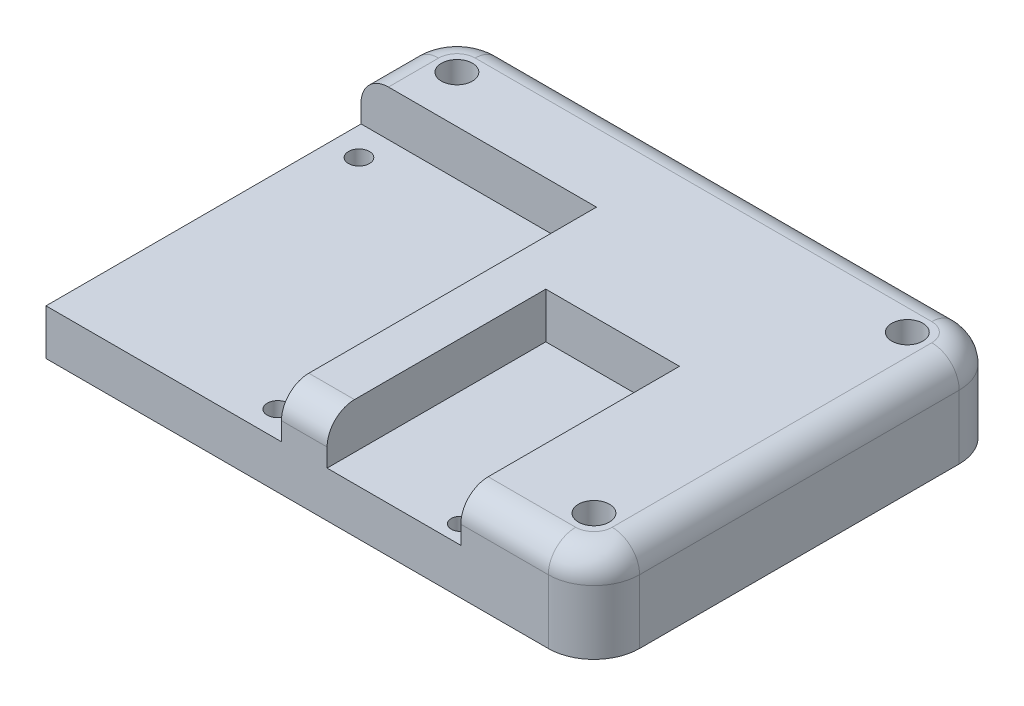
ISO-10303-21;
HEADER;
FILE_DESCRIPTION(('STEP AP214'),'2;1');
FILE_NAME('part.step','',(''),(''),'','','');
FILE_SCHEMA(('AUTOMOTIVE_DESIGN { 1 0 10303 214 1 1 1 1 }'));
ENDSEC;
DATA;
#1=APPLICATION_CONTEXT('core data for automotive mechanical design processes');
#2=APPLICATION_PROTOCOL_DEFINITION('international standard','automotive_design',2000,#1);
#3=PRODUCT_CONTEXT('',#1,'mechanical');
#4=PRODUCT('Part','Part','',(#3));
#5=PRODUCT_RELATED_PRODUCT_CATEGORY('part','',(#4));
#6=PRODUCT_DEFINITION_FORMATION('','',#4);
#7=PRODUCT_DEFINITION_CONTEXT('part definition',#1,'design');
#8=PRODUCT_DEFINITION('design','',#6,#7);
#9=PRODUCT_DEFINITION_SHAPE('','',#8);
#10=(LENGTH_UNIT() NAMED_UNIT(*) SI_UNIT(.MILLI.,.METRE.));
#11=(NAMED_UNIT(*) PLANE_ANGLE_UNIT() SI_UNIT($,.RADIAN.));
#12=(NAMED_UNIT(*) SI_UNIT($,.STERADIAN.) SOLID_ANGLE_UNIT());
#13=UNCERTAINTY_MEASURE_WITH_UNIT(LENGTH_MEASURE(1.E-05),#10,'distance_accuracy_value','');
#14=(GEOMETRIC_REPRESENTATION_CONTEXT(3) GLOBAL_UNCERTAINTY_ASSIGNED_CONTEXT((#13)) GLOBAL_UNIT_ASSIGNED_CONTEXT((#10,
#11,#12)) REPRESENTATION_CONTEXT('',''));
#15=CARTESIAN_POINT('',(0.,0.,0.));
#16=DIRECTION('',(0.,0.,1.));
#17=DIRECTION('',(1.,0.,0.));
#18=AXIS2_PLACEMENT_3D('',#15,#16,#17);
#19=CARTESIAN_POINT('',(-39.1304347826087,10.,-20.7391304347826));
#20=DIRECTION('',(1.,0.,0.));
#21=DIRECTION('',(0.,0.,-1.));
#22=AXIS2_PLACEMENT_3D('',#19,#20,#21);
#23=PLANE('',#22);
#24=DIRECTION('',(0.,1.,0.));
#25=VECTOR('',#24,1.);
#26=CARTESIAN_POINT('',(-39.1304347826087,5.,-10.2391304347826));
#27=LINE('',#26,#25);
#28=CARTESIAN_POINT('',(-39.1304347826087,5.,-10.2391304347826));
#29=VERTEX_POINT('',#28);
#30=CARTESIAN_POINT('',(-39.1304347826087,7.,-10.2391304347826));
#31=VERTEX_POINT('',#30);
#32=EDGE_CURVE('E249',#29,#31,#27,.T.);
#33=ORIENTED_EDGE('',*,*,#32,.T.);
#34=DIRECTION('',(0.,0.,1.));
#35=VECTOR('',#34,1.);
#36=CARTESIAN_POINT('',(-39.1304347826087,7.,-15.7391304347826));
#37=LINE('',#36,#35);
#38=CARTESIAN_POINT('',(-39.1304347826087,7.,-15.7391304347826));
#39=VERTEX_POINT('',#38);
#40=EDGE_CURVE('E314',#31,#39,#37,.F.);
#41=ORIENTED_EDGE('',*,*,#40,.T.);
#42=DIRECTION('',(0.,-1.,0.));
#43=VECTOR('',#42,1.);
#44=CARTESIAN_POINT('',(-39.1304347826087,10.,-15.7391304347826));
#45=LINE('',#44,#43);
#46=CARTESIAN_POINT('',(-39.1304347826087,0.,-15.7391304347826));
#47=VERTEX_POINT('',#46);
#48=EDGE_CURVE('E265',#39,#47,#45,.T.);
#49=ORIENTED_EDGE('',*,*,#48,.T.);
#50=DIRECTION('',(0.,0.,1.));
#51=VECTOR('',#50,1.);
#52=CARTESIAN_POINT('',(-39.1304347826087,0.,-20.7391304347826));
#53=LINE('',#52,#51);
#54=CARTESIAN_POINT('',(-39.1304347826087,0.,24.2608695652174));
#55=VERTEX_POINT('',#54);
#56=EDGE_CURVE('E248',#47,#55,#53,.T.);
#57=ORIENTED_EDGE('',*,*,#56,.T.);
#58=DIRECTION('',(0.,-1.,0.));
#59=VECTOR('',#58,1.);
#60=CARTESIAN_POINT('',(-39.1304347826087,10.,24.2608695652174));
#61=LINE('',#60,#59);
#62=CARTESIAN_POINT('',(-39.1304347826087,5.,24.2608695652174));
#63=VERTEX_POINT('',#62);
#64=EDGE_CURVE('E262',#63,#55,#61,.T.);
#65=ORIENTED_EDGE('',*,*,#64,.F.);
#66=DIRECTION('',(0.,0.,1.));
#67=VECTOR('',#66,1.);
#68=CARTESIAN_POINT('',(-39.1304347826087,5.,24.2608695652174));
#69=LINE('',#68,#67);
#70=EDGE_CURVE('E236',#29,#63,#69,.T.);
#71=ORIENTED_EDGE('',*,*,#70,.F.);
#72=EDGE_LOOP('',(#33,#41,#49,#57,#65,#71));
#73=FACE_BOUND('',#72,.T.);
#74=ADVANCED_FACE('F39',(#73),#23,.F.);
#75=CARTESIAN_POINT('',(-39.1304347826087,10.,24.2608695652174));
#76=DIRECTION('',(0.,0.,-1.));
#77=DIRECTION('',(-1.,0.,0.));
#78=AXIS2_PLACEMENT_3D('',#75,#76,#77);
#79=PLANE('',#78);
#80=DIRECTION('',(0.,1.,0.));
#81=VECTOR('',#80,1.);
#82=CARTESIAN_POINT('',(-8.3504347826087,5.,24.2608695652174));
#83=LINE('',#82,#81);
#84=CARTESIAN_POINT('',(-8.3504347826087,5.,24.2608695652174));
#85=VERTEX_POINT('',#84);
#86=CARTESIAN_POINT('',(-8.3504347826087,7.,24.2608695652174));
#87=VERTEX_POINT('',#86);
#88=EDGE_CURVE('E173',#85,#87,#83,.T.);
#89=ORIENTED_EDGE('',*,*,#88,.T.);
#90=DIRECTION('',(1.,0.,0.));
#91=VECTOR('',#90,1.);
#92=CARTESIAN_POINT('',(-13.3504347826087,7.,24.2608695652174));
#93=LINE('',#92,#91);
#94=CARTESIAN_POINT('',(-13.3504347826087,7.,24.2608695652174));
#95=VERTEX_POINT('',#94);
#96=EDGE_CURVE('E308',#87,#95,#93,.F.);
#97=ORIENTED_EDGE('',*,*,#96,.T.);
#98=DIRECTION('',(0.,1.,0.));
#99=VECTOR('',#98,1.);
#100=CARTESIAN_POINT('',(-13.3504347826087,5.,24.2608695652174));
#101=LINE('',#100,#99);
#102=CARTESIAN_POINT('',(-13.3504347826087,5.,24.2608695652174));
#103=VERTEX_POINT('',#102);
#104=EDGE_CURVE('E245',#103,#95,#101,.T.);
#105=ORIENTED_EDGE('',*,*,#104,.F.);
#106=DIRECTION('',(1.,0.,0.));
#107=VECTOR('',#106,1.);
#108=CARTESIAN_POINT('',(-13.3504347826087,5.,24.2608695652174));
#109=LINE('',#108,#107);
#110=EDGE_CURVE('E238',#63,#103,#109,.T.);
#111=ORIENTED_EDGE('',*,*,#110,.F.);
#112=ORIENTED_EDGE('',*,*,#64,.T.);
#113=DIRECTION('',(1.,0.,0.));
#114=VECTOR('',#113,1.);
#115=CARTESIAN_POINT('',(-39.1304347826087,0.,24.2608695652174));
#116=LINE('',#115,#114);
#117=CARTESIAN_POINT('',(15.8695652173913,0.,24.2608695652174));
#118=VERTEX_POINT('',#117);
#119=EDGE_CURVE('E255',#55,#118,#116,.T.);
#120=ORIENTED_EDGE('',*,*,#119,.T.);
#121=DIRECTION('',(0.,-1.,0.));
#122=VECTOR('',#121,1.);
#123=CARTESIAN_POINT('',(15.8695652173913,10.,24.2608695652174));
#124=LINE('',#123,#122);
#125=CARTESIAN_POINT('',(15.8695652173913,7.,24.2608695652174));
#126=VERTEX_POINT('',#125);
#127=EDGE_CURVE('E284',#118,#126,#124,.F.);
#128=ORIENTED_EDGE('',*,*,#127,.T.);
#129=DIRECTION('',(1.,0.,0.));
#130=VECTOR('',#129,1.);
#131=CARTESIAN_POINT('',(6.2895652173913,7.,24.2608695652174));
#132=LINE('',#131,#130);
#133=CARTESIAN_POINT('',(6.2895652173913,7.,24.2608695652174));
#134=VERTEX_POINT('',#133);
#135=EDGE_CURVE('E306',#126,#134,#132,.F.);
#136=ORIENTED_EDGE('',*,*,#135,.T.);
#137=DIRECTION('',(0.,1.,0.));
#138=VECTOR('',#137,1.);
#139=CARTESIAN_POINT('',(6.2895652173913,5.,24.2608695652174));
#140=LINE('',#139,#138);
#141=CARTESIAN_POINT('',(6.2895652173913,5.,24.2608695652174));
#142=VERTEX_POINT('',#141);
#143=EDGE_CURVE('E183',#142,#134,#140,.T.);
#144=ORIENTED_EDGE('',*,*,#143,.F.);
#145=DIRECTION('',(1.,0.,0.));
#146=VECTOR('',#145,1.);
#147=CARTESIAN_POINT('',(-8.3504347826087,5.,24.2608695652174));
#148=LINE('',#147,#146);
#149=EDGE_CURVE('E190',#85,#142,#148,.T.);
#150=ORIENTED_EDGE('',*,*,#149,.F.);
#151=EDGE_LOOP('',(#89,#97,#105,#111,#112,#120,#128,#136,#144,#150));
#152=FACE_BOUND('',#151,.T.);
#153=ADVANCED_FACE('F195',(#152),#79,.F.);
#154=CARTESIAN_POINT('',(20.8695652173913,10.,-20.7391304347826));
#155=DIRECTION('',(-1.,0.,0.));
#156=DIRECTION('',(0.,0.,1.));
#157=AXIS2_PLACEMENT_3D('',#154,#155,#156);
#158=PLANE('',#157);
#159=DIRECTION('',(0.,-1.,0.));
#160=VECTOR('',#159,1.);
#161=CARTESIAN_POINT('',(20.8695652173913,10.,-15.7391304347826));
#162=LINE('',#161,#160);
#163=CARTESIAN_POINT('',(20.8695652173913,0.,-15.7391304347826));
#164=VERTEX_POINT('',#163);
#165=CARTESIAN_POINT('',(20.8695652173913,7.,-15.7391304347826));
#166=VERTEX_POINT('',#165);
#167=EDGE_CURVE('E278',#164,#166,#162,.F.);
#168=ORIENTED_EDGE('',*,*,#167,.T.);
#169=DIRECTION('',(0.,0.,-1.));
#170=VECTOR('',#169,1.);
#171=CARTESIAN_POINT('',(20.8695652173913,7.,19.2608695652174));
#172=LINE('',#171,#170);
#173=CARTESIAN_POINT('',(20.8695652173913,7.,19.2608695652174));
#174=VERTEX_POINT('',#173);
#175=EDGE_CURVE('E56',#166,#174,#172,.F.);
#176=ORIENTED_EDGE('',*,*,#175,.T.);
#177=DIRECTION('',(0.,-1.,0.));
#178=VECTOR('',#177,1.);
#179=CARTESIAN_POINT('',(20.8695652173913,10.,19.2608695652174));
#180=LINE('',#179,#178);
#181=CARTESIAN_POINT('',(20.8695652173913,0.,19.2608695652174));
#182=VERTEX_POINT('',#181);
#183=EDGE_CURVE('E280',#174,#182,#180,.T.);
#184=ORIENTED_EDGE('',*,*,#183,.T.);
#185=DIRECTION('',(0.,0.,-1.));
#186=VECTOR('',#185,1.);
#187=CARTESIAN_POINT('',(20.8695652173913,0.,-20.7391304347826));
#188=LINE('',#187,#186);
#189=EDGE_CURVE('E258',#182,#164,#188,.T.);
#190=ORIENTED_EDGE('',*,*,#189,.T.);
#191=EDGE_LOOP('',(#168,#176,#184,#190));
#192=FACE_BOUND('',#191,.T.);
#193=ADVANCED_FACE('F448',(#192),#158,.F.);
#194=CARTESIAN_POINT('',(-39.1304347826087,10.,-20.7391304347826));
#195=DIRECTION('',(0.,0.,1.));
#196=DIRECTION('',(1.,0.,0.));
#197=AXIS2_PLACEMENT_3D('',#194,#195,#196);
#198=PLANE('',#197);
#199=DIRECTION('',(0.,-1.,0.));
#200=VECTOR('',#199,1.);
#201=CARTESIAN_POINT('',(-34.1304347826087,10.,-20.7391304347826));
#202=LINE('',#201,#200);
#203=CARTESIAN_POINT('',(-34.1304347826087,0.,-20.7391304347826));
#204=VERTEX_POINT('',#203);
#205=CARTESIAN_POINT('',(-34.1304347826087,7.,-20.7391304347826));
#206=VERTEX_POINT('',#205);
#207=EDGE_CURVE('E270',#204,#206,#202,.F.);
#208=ORIENTED_EDGE('',*,*,#207,.T.);
#209=DIRECTION('',(-1.,0.,0.));
#210=VECTOR('',#209,1.);
#211=CARTESIAN_POINT('',(15.8695652173913,7.,-20.7391304347826));
#212=LINE('',#211,#210);
#213=CARTESIAN_POINT('',(15.8695652173913,7.,-20.7391304347826));
#214=VERTEX_POINT('',#213);
#215=EDGE_CURVE('E318',#206,#214,#212,.F.);
#216=ORIENTED_EDGE('',*,*,#215,.T.);
#217=DIRECTION('',(0.,-1.,0.));
#218=VECTOR('',#217,1.);
#219=CARTESIAN_POINT('',(15.8695652173913,10.,-20.7391304347826));
#220=LINE('',#219,#218);
#221=CARTESIAN_POINT('',(15.8695652173913,0.,-20.7391304347826));
#222=VERTEX_POINT('',#221);
#223=EDGE_CURVE('E273',#214,#222,#220,.T.);
#224=ORIENTED_EDGE('',*,*,#223,.T.);
#225=DIRECTION('',(-1.,0.,0.));
#226=VECTOR('',#225,1.);
#227=CARTESIAN_POINT('',(-39.1304347826087,0.,-20.7391304347826));
#228=LINE('',#227,#226);
#229=EDGE_CURVE('E260',#222,#204,#228,.T.);
#230=ORIENTED_EDGE('',*,*,#229,.T.);
#231=EDGE_LOOP('',(#208,#216,#224,#230));
#232=FACE_BOUND('',#231,.T.);
#233=ADVANCED_FACE('F383',(#232),#198,.F.);
#234=CARTESIAN_POINT('',(0.,10.,0.));
#235=DIRECTION('',(0.,1.,0.));
#236=DIRECTION('',(0.,0.,1.));
#237=AXIS2_PLACEMENT_3D('',#234,#235,#236);
#238=PLANE('',#237);
#239=CARTESIAN_POINT('',(-33.7904347826087,10.,-15.3951904347826));
#240=DIRECTION('',(0.,1.,0.));
#241=DIRECTION('',(0.,0.,1.));
#242=AXIS2_PLACEMENT_3D('',#239,#240,#241);
#243=CIRCLE('',#242,1.7);
#244=CARTESIAN_POINT('',(-33.7904347826087,10.,-13.6951904347826));
#245=VERTEX_POINT('',#244);
#246=EDGE_CURVE('E368',#245,#245,#243,.T.);
#247=ORIENTED_EDGE('',*,*,#246,.F.);
#248=EDGE_LOOP('',(#247));
#249=FACE_BOUND('',#248,.T.);
#250=CARTESIAN_POINT('',(15.5295652173913,10.,-15.3991304347826));
#251=DIRECTION('',(0.,1.,0.));
#252=DIRECTION('',(0.,0.,1.));
#253=AXIS2_PLACEMENT_3D('',#250,#251,#252);
#254=CIRCLE('',#253,1.7);
#255=CARTESIAN_POINT('',(15.5295652173913,10.,-13.6991304347826));
#256=VERTEX_POINT('',#255);
#257=EDGE_CURVE('E361',#256,#256,#254,.T.);
#258=ORIENTED_EDGE('',*,*,#257,.F.);
#259=EDGE_LOOP('',(#258));
#260=FACE_BOUND('',#259,.T.);
#261=CARTESIAN_POINT('',(15.5295652173913,10.,18.9208695652174));
#262=DIRECTION('',(0.,1.,0.));
#263=DIRECTION('',(0.,0.,1.));
#264=AXIS2_PLACEMENT_3D('',#261,#262,#263);
#265=CIRCLE('',#264,1.7);
#266=CARTESIAN_POINT('',(15.5295652173913,10.,20.6208695652174));
#267=VERTEX_POINT('',#266);
#268=EDGE_CURVE('E362',#267,#267,#265,.T.);
#269=ORIENTED_EDGE('',*,*,#268,.F.);
#270=EDGE_LOOP('',(#269));
#271=FACE_BOUND('',#270,.T.);
#272=DIRECTION('',(0.,0.,-1.));
#273=VECTOR('',#272,1.);
#274=CARTESIAN_POINT('',(-13.3504347826087,10.,24.2608695652174));
#275=LINE('',#274,#273);
#276=CARTESIAN_POINT('',(-13.3504347826087,10.,21.2608695652174));
#277=VERTEX_POINT('',#276);
#278=CARTESIAN_POINT('',(-13.3504347826087,10.,-10.2391304347826));
#279=VERTEX_POINT('',#278);
#280=EDGE_CURVE('E224',#277,#279,#275,.T.);
#281=ORIENTED_EDGE('',*,*,#280,.F.);
#282=DIRECTION('',(1.,0.,0.));
#283=VECTOR('',#282,1.);
#284=CARTESIAN_POINT('',(-8.3504347826087,10.,21.2608695652174));
#285=LINE('',#284,#283);
#286=CARTESIAN_POINT('',(-8.3504347826087,10.,21.2608695652174));
#287=VERTEX_POINT('',#286);
#288=EDGE_CURVE('E302',#277,#287,#285,.T.);
#289=ORIENTED_EDGE('',*,*,#288,.T.);
#290=DIRECTION('',(0.,0.,1.));
#291=VECTOR('',#290,1.);
#292=CARTESIAN_POINT('',(-8.3504347826087,10.,24.2608695652174));
#293=LINE('',#292,#291);
#294=CARTESIAN_POINT('',(-8.3504347826087,10.,0.310869565217385));
#295=VERTEX_POINT('',#294);
#296=EDGE_CURVE('E203',#295,#287,#293,.T.);
#297=ORIENTED_EDGE('',*,*,#296,.F.);
#298=DIRECTION('',(-1.,0.,0.));
#299=VECTOR('',#298,1.);
#300=CARTESIAN_POINT('',(-8.3504347826087,10.,0.310869565217385));
#301=LINE('',#300,#299);
#302=CARTESIAN_POINT('',(6.2895652173913,10.,0.310869565217385));
#303=VERTEX_POINT('',#302);
#304=EDGE_CURVE('E193',#303,#295,#301,.T.);
#305=ORIENTED_EDGE('',*,*,#304,.F.);
#306=DIRECTION('',(0.,0.,-1.));
#307=VECTOR('',#306,1.);
#308=CARTESIAN_POINT('',(6.2895652173913,10.,24.2608695652174));
#309=LINE('',#308,#307);
#310=CARTESIAN_POINT('',(6.2895652173913,10.,21.2608695652174));
#311=VERTEX_POINT('',#310);
#312=EDGE_CURVE('E205',#311,#303,#309,.T.);
#313=ORIENTED_EDGE('',*,*,#312,.F.);
#314=DIRECTION('',(1.,0.,0.));
#315=VECTOR('',#314,1.);
#316=CARTESIAN_POINT('',(15.8695652173913,10.,21.2608695652174));
#317=LINE('',#316,#315);
#318=CARTESIAN_POINT('',(15.8695652173913,10.,21.2608695652174));
#319=VERTEX_POINT('',#318);
#320=EDGE_CURVE('E287',#311,#319,#317,.T.);
#321=ORIENTED_EDGE('',*,*,#320,.T.);
#322=CARTESIAN_POINT('',(15.8695652173913,10.,19.2608695652174));
#323=DIRECTION('',(0.,1.,0.));
#324=DIRECTION('',(0.,0.,1.));
#325=AXIS2_PLACEMENT_3D('',#322,#323,#324);
#326=CIRCLE('',#325,2.);
#327=CARTESIAN_POINT('',(17.8695652173913,10.,19.2608695652174));
#328=VERTEX_POINT('',#327);
#329=EDGE_CURVE('E289',#319,#328,#326,.T.);
#330=ORIENTED_EDGE('',*,*,#329,.T.);
#331=DIRECTION('',(0.,0.,-1.));
#332=VECTOR('',#331,1.);
#333=CARTESIAN_POINT('',(17.8695652173913,10.,-15.7391304347826));
#334=LINE('',#333,#332);
#335=CARTESIAN_POINT('',(17.8695652173913,10.,-15.7391304347826));
#336=VERTEX_POINT('',#335);
#337=EDGE_CURVE('E291',#328,#336,#334,.T.);
#338=ORIENTED_EDGE('',*,*,#337,.T.);
#339=CARTESIAN_POINT('',(15.8695652173913,10.,-15.7391304347826));
#340=DIRECTION('',(0.,1.,0.));
#341=DIRECTION('',(0.,0.,1.));
#342=AXIS2_PLACEMENT_3D('',#339,#340,#341);
#343=CIRCLE('',#342,2.);
#344=CARTESIAN_POINT('',(15.8695652173913,10.,-17.7391304347826));
#345=VERTEX_POINT('',#344);
#346=EDGE_CURVE('E293',#336,#345,#343,.T.);
#347=ORIENTED_EDGE('',*,*,#346,.T.);
#348=DIRECTION('',(-1.,0.,0.));
#349=VECTOR('',#348,1.);
#350=CARTESIAN_POINT('',(-34.1304347826087,10.,-17.7391304347826));
#351=LINE('',#350,#349);
#352=CARTESIAN_POINT('',(-34.1304347826087,10.,-17.7391304347826));
#353=VERTEX_POINT('',#352);
#354=EDGE_CURVE('E295',#345,#353,#351,.T.);
#355=ORIENTED_EDGE('',*,*,#354,.T.);
#356=CARTESIAN_POINT('',(-34.1304347826087,10.,-15.7391304347826));
#357=DIRECTION('',(0.,1.,0.));
#358=DIRECTION('',(0.,0.,1.));
#359=AXIS2_PLACEMENT_3D('',#356,#357,#358);
#360=CIRCLE('',#359,2.);
#361=CARTESIAN_POINT('',(-36.1304347826087,10.,-15.7391304347826));
#362=VERTEX_POINT('',#361);
#363=EDGE_CURVE('E297',#353,#362,#360,.T.);
#364=ORIENTED_EDGE('',*,*,#363,.T.);
#365=DIRECTION('',(0.,0.,1.));
#366=VECTOR('',#365,1.);
#367=CARTESIAN_POINT('',(-36.1304347826087,10.,-10.2391304347826));
#368=LINE('',#367,#366);
#369=CARTESIAN_POINT('',(-36.1304347826087,10.,-10.2391304347826));
#370=VERTEX_POINT('',#369);
#371=EDGE_CURVE('E299',#362,#370,#368,.T.);
#372=ORIENTED_EDGE('',*,*,#371,.T.);
#373=DIRECTION('',(-1.,0.,0.));
#374=VECTOR('',#373,1.);
#375=CARTESIAN_POINT('',(-13.3504347826087,10.,-10.2391304347826));
#376=LINE('',#375,#374);
#377=EDGE_CURVE('E233',#279,#370,#376,.T.);
#378=ORIENTED_EDGE('',*,*,#377,.F.);
#379=EDGE_LOOP('',(#281,#289,#297,#305,#313,#321,#330,#338,#347,#355,#364,#372,#378));
#380=FACE_BOUND('',#379,.T.);
#381=ADVANCED_FACE('F379',(#249,#260,#271,#380),#238,.T.);
#382=CARTESIAN_POINT('',(0.,0.,0.));
#383=DIRECTION('',(0.,1.,0.));
#384=DIRECTION('',(0.,0.,1.));
#385=AXIS2_PLACEMENT_3D('',#382,#383,#384);
#386=PLANE('',#385);
#387=CARTESIAN_POINT('',(-33.7904347826087,0.,-15.3951904347826));
#388=DIRECTION('',(0.,1.,0.));
#389=DIRECTION('',(0.,0.,1.));
#390=AXIS2_PLACEMENT_3D('',#387,#388,#389);
#391=CIRCLE('',#390,1.7);
#392=CARTESIAN_POINT('',(-33.7904347826087,0.,-13.6951904347826));
#393=VERTEX_POINT('',#392);
#394=EDGE_CURVE('E327',#393,#393,#391,.F.);
#395=ORIENTED_EDGE('',*,*,#394,.F.);
#396=EDGE_LOOP('',(#395));
#397=FACE_BOUND('',#396,.T.);
#398=CARTESIAN_POINT('',(15.5295652173913,0.,-15.3991304347826));
#399=DIRECTION('',(0.,1.,0.));
#400=DIRECTION('',(0.,0.,1.));
#401=AXIS2_PLACEMENT_3D('',#398,#399,#400);
#402=CIRCLE('',#401,1.7);
#403=CARTESIAN_POINT('',(15.5295652173913,0.,-13.6991304347826));
#404=VERTEX_POINT('',#403);
#405=EDGE_CURVE('E365',#404,#404,#402,.F.);
#406=ORIENTED_EDGE('',*,*,#405,.F.);
#407=EDGE_LOOP('',(#406));
#408=FACE_BOUND('',#407,.T.);
#409=CARTESIAN_POINT('',(15.5295652173913,0.,18.9208695652174));
#410=DIRECTION('',(0.,1.,0.));
#411=DIRECTION('',(0.,0.,1.));
#412=AXIS2_PLACEMENT_3D('',#409,#410,#411);
#413=CIRCLE('',#412,1.7);
#414=CARTESIAN_POINT('',(15.5295652173913,0.,20.6208695652174));
#415=VERTEX_POINT('',#414);
#416=EDGE_CURVE('E358',#415,#415,#413,.F.);
#417=ORIENTED_EDGE('',*,*,#416,.F.);
#418=EDGE_LOOP('',(#417));
#419=FACE_BOUND('',#418,.T.);
#420=CARTESIAN_POINT('',(4.2445652173913,0.,2.33086956521739));
#421=DIRECTION('',(0.,1.,0.));
#422=DIRECTION('',(0.,0.,1.));
#423=AXIS2_PLACEMENT_3D('',#420,#421,#422);
#424=CIRCLE('',#423,1.015);
#425=CARTESIAN_POINT('',(4.2445652173913,0.,3.34586956521739));
#426=VERTEX_POINT('',#425);
#427=EDGE_CURVE('E206',#426,#426,#424,.F.);
#428=ORIENTED_EDGE('',*,*,#427,.F.);
#429=EDGE_LOOP('',(#428));
#430=FACE_BOUND('',#429,.T.);
#431=CARTESIAN_POINT('',(4.2395652173913,0.,22.2458695652174));
#432=DIRECTION('',(0.,1.,0.));
#433=DIRECTION('',(0.,0.,1.));
#434=AXIS2_PLACEMENT_3D('',#431,#432,#433);
#435=CIRCLE('',#434,1.015);
#436=CARTESIAN_POINT('',(4.2395652173913,0.,23.2608695652174));
#437=VERTEX_POINT('',#436);
#438=EDGE_CURVE('E347',#437,#437,#435,.F.);
#439=ORIENTED_EDGE('',*,*,#438,.F.);
#440=EDGE_LOOP('',(#439));
#441=FACE_BOUND('',#440,.T.);
#442=CARTESIAN_POINT('',(-36.0604347826087,0.,-6.93913043478262));
#443=DIRECTION('',(0.,1.,0.));
#444=DIRECTION('',(0.,0.,1.));
#445=AXIS2_PLACEMENT_3D('',#442,#443,#444);
#446=CIRCLE('',#445,1.15);
#447=CARTESIAN_POINT('',(-36.0604347826087,0.,-5.78913043478261));
#448=VERTEX_POINT('',#447);
#449=EDGE_CURVE('E220',#448,#448,#446,.F.);
#450=ORIENTED_EDGE('',*,*,#449,.F.);
#451=EDGE_LOOP('',(#450));
#452=FACE_BOUND('',#451,.T.);
#453=CARTESIAN_POINT('',(-16.6404347826087,0.,21.3708695652174));
#454=DIRECTION('',(0.,1.,0.));
#455=DIRECTION('',(0.,0.,1.));
#456=AXIS2_PLACEMENT_3D('',#453,#454,#455);
#457=CIRCLE('',#456,1.15);
#458=CARTESIAN_POINT('',(-16.6404347826087,0.,22.5208695652174));
#459=VERTEX_POINT('',#458);
#460=EDGE_CURVE('E221',#459,#459,#457,.F.);
#461=ORIENTED_EDGE('',*,*,#460,.F.);
#462=EDGE_LOOP('',(#461));
#463=FACE_BOUND('',#462,.T.);
#464=ORIENTED_EDGE('',*,*,#189,.F.);
#465=CARTESIAN_POINT('',(15.8695652173913,0.,19.2608695652174));
#466=DIRECTION('',(0.,1.,0.));
#467=DIRECTION('',(0.,0.,1.));
#468=AXIS2_PLACEMENT_3D('',#465,#466,#467);
#469=CIRCLE('',#468,5.);
#470=EDGE_CURVE('E282',#182,#118,#469,.F.);
#471=ORIENTED_EDGE('',*,*,#470,.T.);
#472=ORIENTED_EDGE('',*,*,#119,.F.);
#473=ORIENTED_EDGE('',*,*,#56,.F.);
#474=CARTESIAN_POINT('',(-34.1304347826087,0.,-15.7391304347826));
#475=DIRECTION('',(0.,1.,0.));
#476=DIRECTION('',(0.,0.,1.));
#477=AXIS2_PLACEMENT_3D('',#474,#475,#476);
#478=CIRCLE('',#477,5.);
#479=EDGE_CURVE('E267',#47,#204,#478,.F.);
#480=ORIENTED_EDGE('',*,*,#479,.T.);
#481=ORIENTED_EDGE('',*,*,#229,.F.);
#482=CARTESIAN_POINT('',(15.8695652173913,0.,-15.7391304347826));
#483=DIRECTION('',(0.,1.,0.));
#484=DIRECTION('',(0.,0.,1.));
#485=AXIS2_PLACEMENT_3D('',#482,#483,#484);
#486=CIRCLE('',#485,5.);
#487=EDGE_CURVE('E275',#222,#164,#486,.F.);
#488=ORIENTED_EDGE('',*,*,#487,.T.);
#489=EDGE_LOOP('',(#464,#471,#472,#473,#480,#481,#488));
#490=FACE_BOUND('',#489,.T.);
#491=ADVANCED_FACE('F382',(#397,#408,#419,#430,#441,#452,#463,#490),#386,.F.);
#492=CARTESIAN_POINT('',(-13.3504347826087,5.,24.2608695652174));
#493=DIRECTION('',(1.,0.,0.));
#494=DIRECTION('',(0.,0.,-1.));
#495=AXIS2_PLACEMENT_3D('',#492,#493,#494);
#496=PLANE('',#495);
#497=ORIENTED_EDGE('',*,*,#104,.T.);
#498=CARTESIAN_POINT('',(-13.3504347826087,7.,21.2608695652174));
#499=DIRECTION('',(1.,0.,0.));
#500=DIRECTION('',(0.,0.,-1.));
#501=AXIS2_PLACEMENT_3D('',#498,#499,#500);
#502=CIRCLE('',#501,3.);
#503=EDGE_CURVE('E310',#95,#277,#502,.F.);
#504=ORIENTED_EDGE('',*,*,#503,.T.);
#505=ORIENTED_EDGE('',*,*,#280,.T.);
#506=DIRECTION('',(0.,1.,0.));
#507=VECTOR('',#506,1.);
#508=CARTESIAN_POINT('',(-13.3504347826087,5.,-10.2391304347826));
#509=LINE('',#508,#507);
#510=CARTESIAN_POINT('',(-13.3504347826087,5.,-10.2391304347826));
#511=VERTEX_POINT('',#510);
#512=EDGE_CURVE('E241',#511,#279,#509,.T.);
#513=ORIENTED_EDGE('',*,*,#512,.F.);
#514=DIRECTION('',(0.,0.,-1.));
#515=VECTOR('',#514,1.);
#516=CARTESIAN_POINT('',(-13.3504347826087,5.,24.2608695652174));
#517=LINE('',#516,#515);
#518=EDGE_CURVE('E229',#103,#511,#517,.T.);
#519=ORIENTED_EDGE('',*,*,#518,.F.);
#520=EDGE_LOOP('',(#497,#504,#505,#513,#519));
#521=FACE_BOUND('',#520,.T.);
#522=ADVANCED_FACE('F399',(#521),#496,.F.);
#523=CARTESIAN_POINT('',(-13.3504347826087,5.,-10.2391304347826));
#524=DIRECTION('',(0.,0.,-1.));
#525=DIRECTION('',(-1.,0.,0.));
#526=AXIS2_PLACEMENT_3D('',#523,#524,#525);
#527=PLANE('',#526);
#528=ORIENTED_EDGE('',*,*,#377,.T.);
#529=CARTESIAN_POINT('',(-36.1304347826087,7.,-10.2391304347826));
#530=DIRECTION('',(0.,0.,-1.));
#531=DIRECTION('',(-1.,0.,0.));
#532=AXIS2_PLACEMENT_3D('',#529,#530,#531);
#533=CIRCLE('',#532,3.);
#534=EDGE_CURVE('E312',#370,#31,#533,.F.);
#535=ORIENTED_EDGE('',*,*,#534,.T.);
#536=ORIENTED_EDGE('',*,*,#32,.F.);
#537=DIRECTION('',(-1.,0.,0.));
#538=VECTOR('',#537,1.);
#539=CARTESIAN_POINT('',(-13.3504347826087,5.,-10.2391304347826));
#540=LINE('',#539,#538);
#541=EDGE_CURVE('E232',#511,#29,#540,.T.);
#542=ORIENTED_EDGE('',*,*,#541,.F.);
#543=ORIENTED_EDGE('',*,*,#512,.T.);
#544=EDGE_LOOP('',(#528,#535,#536,#542,#543));
#545=FACE_BOUND('',#544,.T.);
#546=ADVANCED_FACE('F542',(#545),#527,.F.);
#547=CARTESIAN_POINT('',(0.,5.,0.));
#548=DIRECTION('',(0.,1.,0.));
#549=DIRECTION('',(0.,0.,1.));
#550=AXIS2_PLACEMENT_3D('',#547,#548,#549);
#551=PLANE('',#550);
#552=CARTESIAN_POINT('',(-36.0604347826087,5.,-6.93913043478262));
#553=DIRECTION('',(0.,1.,0.));
#554=DIRECTION('',(0.,0.,1.));
#555=AXIS2_PLACEMENT_3D('',#552,#553,#554);
#556=CIRCLE('',#555,1.15);
#557=CARTESIAN_POINT('',(-36.0604347826087,5.,-5.78913043478261));
#558=VERTEX_POINT('',#557);
#559=EDGE_CURVE('E217',#558,#558,#556,.T.);
#560=ORIENTED_EDGE('',*,*,#559,.F.);
#561=EDGE_LOOP('',(#560));
#562=FACE_BOUND('',#561,.T.);
#563=CARTESIAN_POINT('',(-16.6404347826087,5.,21.3708695652174));
#564=DIRECTION('',(0.,1.,0.));
#565=DIRECTION('',(0.,0.,1.));
#566=AXIS2_PLACEMENT_3D('',#563,#564,#565);
#567=CIRCLE('',#566,1.15);
#568=CARTESIAN_POINT('',(-16.6404347826087,5.,22.5208695652174));
#569=VERTEX_POINT('',#568);
#570=EDGE_CURVE('E212',#569,#569,#567,.T.);
#571=ORIENTED_EDGE('',*,*,#570,.F.);
#572=EDGE_LOOP('',(#571));
#573=FACE_BOUND('',#572,.T.);
#574=ORIENTED_EDGE('',*,*,#518,.T.);
#575=ORIENTED_EDGE('',*,*,#541,.T.);
#576=ORIENTED_EDGE('',*,*,#70,.T.);
#577=ORIENTED_EDGE('',*,*,#110,.T.);
#578=EDGE_LOOP('',(#574,#575,#576,#577));
#579=FACE_BOUND('',#578,.T.);
#580=ADVANCED_FACE('F402',(#562,#573,#579),#551,.T.);
#581=CARTESIAN_POINT('',(-16.6404347826087,-0.00100000000000013,21.3708695652174));
#582=DIRECTION('',(0.,1.,0.));
#583=DIRECTION('',(0.,0.,1.));
#584=AXIS2_PLACEMENT_3D('',#581,#582,#583);
#585=CYLINDRICAL_SURFACE('',#584,1.15);
#586=ORIENTED_EDGE('',*,*,#570,.T.);
#587=EDGE_LOOP('',(#586));
#588=FACE_BOUND('',#587,.T.);
#589=ORIENTED_EDGE('',*,*,#460,.T.);
#590=EDGE_LOOP('',(#589));
#591=FACE_BOUND('',#590,.T.);
#592=ADVANCED_FACE('F594',(#588,#591),#585,.F.);
#593=CARTESIAN_POINT('',(-36.0604347826087,-0.00100000000000013,-6.93913043478262));
#594=DIRECTION('',(0.,1.,0.));
#595=DIRECTION('',(0.,0.,1.));
#596=AXIS2_PLACEMENT_3D('',#593,#594,#595);
#597=CYLINDRICAL_SURFACE('',#596,1.15);
#598=ORIENTED_EDGE('',*,*,#559,.T.);
#599=EDGE_LOOP('',(#598));
#600=FACE_BOUND('',#599,.T.);
#601=ORIENTED_EDGE('',*,*,#449,.T.);
#602=EDGE_LOOP('',(#601));
#603=FACE_BOUND('',#602,.T.);
#604=ADVANCED_FACE('F440',(#600,#603),#597,.F.);
#605=CARTESIAN_POINT('',(-8.3504347826087,5.,24.2608695652174));
#606=DIRECTION('',(-1.,0.,0.));
#607=DIRECTION('',(0.,0.,1.));
#608=AXIS2_PLACEMENT_3D('',#605,#606,#607);
#609=PLANE('',#608);
#610=ORIENTED_EDGE('',*,*,#296,.T.);
#611=CARTESIAN_POINT('',(-8.3504347826087,7.,21.2608695652174));
#612=DIRECTION('',(-1.,0.,0.));
#613=DIRECTION('',(0.,0.,1.));
#614=AXIS2_PLACEMENT_3D('',#611,#612,#613);
#615=CIRCLE('',#614,3.);
#616=EDGE_CURVE('E179',#287,#87,#615,.F.);
#617=ORIENTED_EDGE('',*,*,#616,.T.);
#618=ORIENTED_EDGE('',*,*,#88,.F.);
#619=DIRECTION('',(0.,0.,1.));
#620=VECTOR('',#619,1.);
#621=CARTESIAN_POINT('',(-8.3504347826087,5.,24.2608695652174));
#622=LINE('',#621,#620);
#623=CARTESIAN_POINT('',(-8.3504347826087,5.,0.310869565217385));
#624=VERTEX_POINT('',#623);
#625=EDGE_CURVE('E177',#624,#85,#622,.T.);
#626=ORIENTED_EDGE('',*,*,#625,.F.);
#627=DIRECTION('',(0.,1.,0.));
#628=VECTOR('',#627,1.);
#629=CARTESIAN_POINT('',(-8.3504347826087,5.,0.310869565217385));
#630=LINE('',#629,#628);
#631=EDGE_CURVE('E210',#624,#295,#630,.T.);
#632=ORIENTED_EDGE('',*,*,#631,.T.);
#633=EDGE_LOOP('',(#610,#617,#618,#626,#632));
#634=FACE_BOUND('',#633,.T.);
#635=ADVANCED_FACE('F176',(#634),#609,.F.);
#636=CARTESIAN_POINT('',(-8.3504347826087,5.,0.310869565217385));
#637=DIRECTION('',(0.,0.,-1.));
#638=DIRECTION('',(-1.,0.,0.));
#639=AXIS2_PLACEMENT_3D('',#636,#637,#638);
#640=PLANE('',#639);
#641=ORIENTED_EDGE('',*,*,#304,.T.);
#642=ORIENTED_EDGE('',*,*,#631,.F.);
#643=DIRECTION('',(-1.,0.,0.));
#644=VECTOR('',#643,1.);
#645=CARTESIAN_POINT('',(-8.3504347826087,5.,0.310869565217385));
#646=LINE('',#645,#644);
#647=CARTESIAN_POINT('',(6.2895652173913,5.,0.310869565217385));
#648=VERTEX_POINT('',#647);
#649=EDGE_CURVE('E184',#648,#624,#646,.T.);
#650=ORIENTED_EDGE('',*,*,#649,.F.);
#651=DIRECTION('',(0.,1.,0.));
#652=VECTOR('',#651,1.);
#653=CARTESIAN_POINT('',(6.2895652173913,5.,0.310869565217385));
#654=LINE('',#653,#652);
#655=EDGE_CURVE('E213',#648,#303,#654,.T.);
#656=ORIENTED_EDGE('',*,*,#655,.T.);
#657=EDGE_LOOP('',(#641,#642,#650,#656));
#658=FACE_BOUND('',#657,.T.);
#659=ADVANCED_FACE('F432',(#658),#640,.F.);
#660=CARTESIAN_POINT('',(6.2895652173913,5.,24.2608695652174));
#661=DIRECTION('',(1.,0.,0.));
#662=DIRECTION('',(0.,0.,-1.));
#663=AXIS2_PLACEMENT_3D('',#660,#661,#662);
#664=PLANE('',#663);
#665=ORIENTED_EDGE('',*,*,#143,.T.);
#666=CARTESIAN_POINT('',(6.2895652173913,7.,21.2608695652174));
#667=DIRECTION('',(1.,0.,0.));
#668=DIRECTION('',(0.,0.,-1.));
#669=AXIS2_PLACEMENT_3D('',#666,#667,#668);
#670=CIRCLE('',#669,3.);
#671=EDGE_CURVE('E11',#134,#311,#670,.F.);
#672=ORIENTED_EDGE('',*,*,#671,.T.);
#673=ORIENTED_EDGE('',*,*,#312,.T.);
#674=ORIENTED_EDGE('',*,*,#655,.F.);
#675=DIRECTION('',(0.,0.,-1.));
#676=VECTOR('',#675,1.);
#677=CARTESIAN_POINT('',(6.2895652173913,5.,24.2608695652174));
#678=LINE('',#677,#676);
#679=EDGE_CURVE('E197',#142,#648,#678,.T.);
#680=ORIENTED_EDGE('',*,*,#679,.F.);
#681=EDGE_LOOP('',(#665,#672,#673,#674,#680));
#682=FACE_BOUND('',#681,.T.);
#683=ADVANCED_FACE('F430',(#682),#664,.F.);
#684=CARTESIAN_POINT('',(0.,5.,0.));
#685=DIRECTION('',(0.,-1.,0.));
#686=DIRECTION('',(0.,0.,-1.));
#687=AXIS2_PLACEMENT_3D('',#684,#685,#686);
#688=PLANE('',#687);
#689=CARTESIAN_POINT('',(4.2445652173913,5.,2.33086956521739));
#690=DIRECTION('',(0.,1.,0.));
#691=DIRECTION('',(0.,0.,1.));
#692=AXIS2_PLACEMENT_3D('',#689,#690,#691);
#693=CIRCLE('',#692,1.015);
#694=CARTESIAN_POINT('',(4.2445652173913,5.,3.34586956521739));
#695=VERTEX_POINT('',#694);
#696=EDGE_CURVE('E352',#695,#695,#693,.T.);
#697=ORIENTED_EDGE('',*,*,#696,.F.);
#698=EDGE_LOOP('',(#697));
#699=FACE_BOUND('',#698,.T.);
#700=CARTESIAN_POINT('',(4.2395652173913,5.,22.2458695652174));
#701=DIRECTION('',(0.,1.,0.));
#702=DIRECTION('',(0.,0.,1.));
#703=AXIS2_PLACEMENT_3D('',#700,#701,#702);
#704=CIRCLE('',#703,1.015);
#705=CARTESIAN_POINT('',(4.2395652173913,5.,23.2608695652174));
#706=VERTEX_POINT('',#705);
#707=EDGE_CURVE('E341',#706,#706,#704,.T.);
#708=ORIENTED_EDGE('',*,*,#707,.F.);
#709=EDGE_LOOP('',(#708));
#710=FACE_BOUND('',#709,.T.);
#711=ORIENTED_EDGE('',*,*,#625,.T.);
#712=ORIENTED_EDGE('',*,*,#149,.T.);
#713=ORIENTED_EDGE('',*,*,#679,.T.);
#714=ORIENTED_EDGE('',*,*,#649,.T.);
#715=EDGE_LOOP('',(#711,#712,#713,#714));
#716=FACE_BOUND('',#715,.T.);
#717=ADVANCED_FACE('F188',(#699,#710,#716),#688,.F.);
#718=CARTESIAN_POINT('',(4.2395652173913,-0.00100000000000013,22.2458695652174));
#719=DIRECTION('',(0.,1.,0.));
#720=DIRECTION('',(0.,0.,1.));
#721=AXIS2_PLACEMENT_3D('',#718,#719,#720);
#722=CYLINDRICAL_SURFACE('',#721,1.015);
#723=ORIENTED_EDGE('',*,*,#707,.T.);
#724=EDGE_LOOP('',(#723));
#725=FACE_BOUND('',#724,.T.);
#726=ORIENTED_EDGE('',*,*,#438,.T.);
#727=EDGE_LOOP('',(#726));
#728=FACE_BOUND('',#727,.T.);
#729=ADVANCED_FACE('F511',(#725,#728),#722,.F.);
#730=CARTESIAN_POINT('',(4.2445652173913,-0.00100000000000013,2.33086956521739));
#731=DIRECTION('',(0.,1.,0.));
#732=DIRECTION('',(0.,0.,1.));
#733=AXIS2_PLACEMENT_3D('',#730,#731,#732);
#734=CYLINDRICAL_SURFACE('',#733,1.015);
#735=ORIENTED_EDGE('',*,*,#696,.T.);
#736=EDGE_LOOP('',(#735));
#737=FACE_BOUND('',#736,.T.);
#738=ORIENTED_EDGE('',*,*,#427,.T.);
#739=EDGE_LOOP('',(#738));
#740=FACE_BOUND('',#739,.T.);
#741=ADVANCED_FACE('F456',(#737,#740),#734,.F.);
#742=CARTESIAN_POINT('',(-34.1304347826087,10.,-15.7391304347826));
#743=DIRECTION('',(0.,-1.,0.));
#744=DIRECTION('',(0.,0.,-1.));
#745=AXIS2_PLACEMENT_3D('',#742,#743,#744);
#746=CYLINDRICAL_SURFACE('',#745,5.);
#747=ORIENTED_EDGE('',*,*,#48,.F.);
#748=CARTESIAN_POINT('',(-34.1304347826087,7.,-15.7391304347826));
#749=DIRECTION('',(0.,1.,0.));
#750=DIRECTION('',(0.,0.,1.));
#751=AXIS2_PLACEMENT_3D('',#748,#749,#750);
#752=CIRCLE('',#751,5.);
#753=EDGE_CURVE('E316',#39,#206,#752,.F.);
#754=ORIENTED_EDGE('',*,*,#753,.T.);
#755=ORIENTED_EDGE('',*,*,#207,.F.);
#756=ORIENTED_EDGE('',*,*,#479,.F.);
#757=EDGE_LOOP('',(#747,#754,#755,#756));
#758=FACE_BOUND('',#757,.T.);
#759=ADVANCED_FACE('F452',(#758),#746,.T.);
#760=CARTESIAN_POINT('',(15.8695652173913,10.,-15.7391304347826));
#761=DIRECTION('',(0.,-1.,0.));
#762=DIRECTION('',(0.,0.,-1.));
#763=AXIS2_PLACEMENT_3D('',#760,#761,#762);
#764=CYLINDRICAL_SURFACE('',#763,5.);
#765=ORIENTED_EDGE('',*,*,#223,.F.);
#766=CARTESIAN_POINT('',(15.8695652173913,7.,-15.7391304347826));
#767=DIRECTION('',(0.,1.,0.));
#768=DIRECTION('',(0.,0.,1.));
#769=AXIS2_PLACEMENT_3D('',#766,#767,#768);
#770=CIRCLE('',#769,5.);
#771=EDGE_CURVE('E64',#214,#166,#770,.F.);
#772=ORIENTED_EDGE('',*,*,#771,.T.);
#773=ORIENTED_EDGE('',*,*,#167,.F.);
#774=ORIENTED_EDGE('',*,*,#487,.F.);
#775=EDGE_LOOP('',(#765,#772,#773,#774));
#776=FACE_BOUND('',#775,.T.);
#777=ADVANCED_FACE('F455',(#776),#764,.T.);
#778=CARTESIAN_POINT('',(15.8695652173913,10.,19.2608695652174));
#779=DIRECTION('',(0.,-1.,0.));
#780=DIRECTION('',(0.,0.,-1.));
#781=AXIS2_PLACEMENT_3D('',#778,#779,#780);
#782=CYLINDRICAL_SURFACE('',#781,5.);
#783=ORIENTED_EDGE('',*,*,#183,.F.);
#784=CARTESIAN_POINT('',(15.8695652173913,7.,19.2608695652174));
#785=DIRECTION('',(0.,1.,0.));
#786=DIRECTION('',(0.,0.,1.));
#787=AXIS2_PLACEMENT_3D('',#784,#785,#786);
#788=CIRCLE('',#787,5.);
#789=EDGE_CURVE('E48',#174,#126,#788,.F.);
#790=ORIENTED_EDGE('',*,*,#789,.T.);
#791=ORIENTED_EDGE('',*,*,#127,.F.);
#792=ORIENTED_EDGE('',*,*,#470,.F.);
#793=EDGE_LOOP('',(#783,#790,#791,#792));
#794=FACE_BOUND('',#793,.T.);
#795=ADVANCED_FACE('F418',(#794),#782,.T.);
#796=CARTESIAN_POINT('',(0.,7.,21.2608695652174));
#797=DIRECTION('',(-1.,0.,0.));
#798=DIRECTION('',(0.,0.,1.));
#799=AXIS2_PLACEMENT_3D('',#796,#797,#798);
#800=CYLINDRICAL_SURFACE('',#799,3.);
#801=ORIENTED_EDGE('',*,*,#503,.F.);
#802=ORIENTED_EDGE('',*,*,#96,.F.);
#803=ORIENTED_EDGE('',*,*,#616,.F.);
#804=ORIENTED_EDGE('',*,*,#288,.F.);
#805=EDGE_LOOP('',(#801,#802,#803,#804));
#806=FACE_BOUND('',#805,.T.);
#807=ADVANCED_FACE('F396',(#806),#800,.T.);
#808=CARTESIAN_POINT('',(0.,7.,21.2608695652174));
#809=DIRECTION('',(-1.,0.,0.));
#810=DIRECTION('',(0.,0.,1.));
#811=AXIS2_PLACEMENT_3D('',#808,#809,#810);
#812=CYLINDRICAL_SURFACE('',#811,3.);
#813=ORIENTED_EDGE('',*,*,#671,.F.);
#814=ORIENTED_EDGE('',*,*,#135,.F.);
#815=CARTESIAN_POINT('',(15.8695652173913,7.,21.2608695652174));
#816=DIRECTION('',(1.,0.,0.));
#817=DIRECTION('',(0.,0.,-1.));
#818=AXIS2_PLACEMENT_3D('',#815,#816,#817);
#819=CIRCLE('',#818,3.);
#820=EDGE_CURVE('E43',#319,#126,#819,.T.);
#821=ORIENTED_EDGE('',*,*,#820,.F.);
#822=ORIENTED_EDGE('',*,*,#320,.F.);
#823=EDGE_LOOP('',(#813,#814,#821,#822));
#824=FACE_BOUND('',#823,.T.);
#825=ADVANCED_FACE('F41',(#824),#812,.T.);
#826=CARTESIAN_POINT('',(15.8695652173913,7.,19.2608695652174));
#827=DIRECTION('',(0.,1.,0.));
#828=DIRECTION('',(0.,0.,1.));
#829=AXIS2_PLACEMENT_3D('',#826,#827,#828);
#830=DEGENERATE_TOROIDAL_SURFACE('',#829,2.,3.,.T.);
#831=ORIENTED_EDGE('',*,*,#820,.T.);
#832=ORIENTED_EDGE('',*,*,#789,.F.);
#833=CARTESIAN_POINT('',(17.8695652173913,7.,19.2608695652174));
#834=DIRECTION('',(0.,0.,-1.));
#835=DIRECTION('',(-1.,0.,0.));
#836=AXIS2_PLACEMENT_3D('',#833,#834,#835);
#837=CIRCLE('',#836,3.);
#838=EDGE_CURVE('E335',#328,#174,#837,.T.);
#839=ORIENTED_EDGE('',*,*,#838,.F.);
#840=ORIENTED_EDGE('',*,*,#329,.F.);
#841=EDGE_LOOP('',(#831,#832,#839,#840));
#842=FACE_BOUND('',#841,.T.);
#843=ADVANCED_FACE('F419',(#842),#830,.T.);
#844=CARTESIAN_POINT('',(17.8695652173913,7.,0.));
#845=DIRECTION('',(0.,0.,1.));
#846=DIRECTION('',(1.,0.,0.));
#847=AXIS2_PLACEMENT_3D('',#844,#845,#846);
#848=CYLINDRICAL_SURFACE('',#847,3.);
#849=ORIENTED_EDGE('',*,*,#838,.T.);
#850=ORIENTED_EDGE('',*,*,#175,.F.);
#851=CARTESIAN_POINT('',(17.8695652173913,7.,-15.7391304347826));
#852=DIRECTION('',(0.,0.,-1.));
#853=DIRECTION('',(-1.,0.,0.));
#854=AXIS2_PLACEMENT_3D('',#851,#852,#853);
#855=CIRCLE('',#854,3.);
#856=EDGE_CURVE('E333',#336,#166,#855,.T.);
#857=ORIENTED_EDGE('',*,*,#856,.F.);
#858=ORIENTED_EDGE('',*,*,#337,.F.);
#859=EDGE_LOOP('',(#849,#850,#857,#858));
#860=FACE_BOUND('',#859,.T.);
#861=ADVANCED_FACE('F421',(#860),#848,.T.);
#862=CARTESIAN_POINT('',(15.8695652173913,7.,-15.7391304347826));
#863=DIRECTION('',(0.,1.,0.));
#864=DIRECTION('',(0.,0.,1.));
#865=AXIS2_PLACEMENT_3D('',#862,#863,#864);
#866=DEGENERATE_TOROIDAL_SURFACE('',#865,2.,3.,.T.);
#867=ORIENTED_EDGE('',*,*,#856,.T.);
#868=ORIENTED_EDGE('',*,*,#771,.F.);
#869=CARTESIAN_POINT('',(15.8695652173913,7.,-17.7391304347826));
#870=DIRECTION('',(-1.,0.,0.));
#871=DIRECTION('',(0.,0.,1.));
#872=AXIS2_PLACEMENT_3D('',#869,#870,#871);
#873=CIRCLE('',#872,3.);
#874=EDGE_CURVE('E330',#345,#214,#873,.T.);
#875=ORIENTED_EDGE('',*,*,#874,.F.);
#876=ORIENTED_EDGE('',*,*,#346,.F.);
#877=EDGE_LOOP('',(#867,#868,#875,#876));
#878=FACE_BOUND('',#877,.T.);
#879=ADVANCED_FACE('F476',(#878),#866,.T.);
#880=CARTESIAN_POINT('',(0.,7.,-17.7391304347826));
#881=DIRECTION('',(1.,0.,0.));
#882=DIRECTION('',(0.,0.,-1.));
#883=AXIS2_PLACEMENT_3D('',#880,#881,#882);
#884=CYLINDRICAL_SURFACE('',#883,3.);
#885=ORIENTED_EDGE('',*,*,#874,.T.);
#886=ORIENTED_EDGE('',*,*,#215,.F.);
#887=CARTESIAN_POINT('',(-34.1304347826087,7.,-17.7391304347826));
#888=DIRECTION('',(-1.,0.,0.));
#889=DIRECTION('',(0.,0.,1.));
#890=AXIS2_PLACEMENT_3D('',#887,#888,#889);
#891=CIRCLE('',#890,3.);
#892=EDGE_CURVE('E326',#353,#206,#891,.T.);
#893=ORIENTED_EDGE('',*,*,#892,.F.);
#894=ORIENTED_EDGE('',*,*,#354,.F.);
#895=EDGE_LOOP('',(#885,#886,#893,#894));
#896=FACE_BOUND('',#895,.T.);
#897=ADVANCED_FACE('F472',(#896),#884,.T.);
#898=CARTESIAN_POINT('',(-34.1304347826087,7.,-15.7391304347826));
#899=DIRECTION('',(0.,1.,0.));
#900=DIRECTION('',(0.,0.,1.));
#901=AXIS2_PLACEMENT_3D('',#898,#899,#900);
#902=DEGENERATE_TOROIDAL_SURFACE('',#901,2.,3.,.T.);
#903=ORIENTED_EDGE('',*,*,#892,.T.);
#904=ORIENTED_EDGE('',*,*,#753,.F.);
#905=CARTESIAN_POINT('',(-36.1304347826087,7.,-15.7391304347826));
#906=DIRECTION('',(0.,0.,1.));
#907=DIRECTION('',(1.,0.,0.));
#908=AXIS2_PLACEMENT_3D('',#905,#906,#907);
#909=CIRCLE('',#908,3.);
#910=EDGE_CURVE('E323',#362,#39,#909,.T.);
#911=ORIENTED_EDGE('',*,*,#910,.F.);
#912=ORIENTED_EDGE('',*,*,#363,.F.);
#913=EDGE_LOOP('',(#903,#904,#911,#912));
#914=FACE_BOUND('',#913,.T.);
#915=ADVANCED_FACE('F468',(#914),#902,.T.);
#916=CARTESIAN_POINT('',(-36.1304347826087,7.,0.));
#917=DIRECTION('',(0.,0.,-1.));
#918=DIRECTION('',(-1.,0.,0.));
#919=AXIS2_PLACEMENT_3D('',#916,#917,#918);
#920=CYLINDRICAL_SURFACE('',#919,3.);
#921=ORIENTED_EDGE('',*,*,#910,.T.);
#922=ORIENTED_EDGE('',*,*,#40,.F.);
#923=ORIENTED_EDGE('',*,*,#534,.F.);
#924=ORIENTED_EDGE('',*,*,#371,.F.);
#925=EDGE_LOOP('',(#921,#922,#923,#924));
#926=FACE_BOUND('',#925,.T.);
#927=ADVANCED_FACE('F464',(#926),#920,.T.);
#928=CARTESIAN_POINT('',(15.5295652173913,-0.000999999999999265,18.9208695652174));
#929=DIRECTION('',(0.,1.,0.));
#930=DIRECTION('',(0.,0.,1.));
#931=AXIS2_PLACEMENT_3D('',#928,#929,#930);
#932=CYLINDRICAL_SURFACE('',#931,1.7);
#933=ORIENTED_EDGE('',*,*,#268,.T.);
#934=EDGE_LOOP('',(#933));
#935=FACE_BOUND('',#934,.T.);
#936=ORIENTED_EDGE('',*,*,#416,.T.);
#937=EDGE_LOOP('',(#936));
#938=FACE_BOUND('',#937,.T.);
#939=ADVANCED_FACE('F467',(#935,#938),#932,.F.);
#940=CARTESIAN_POINT('',(15.5295652173913,-0.000999999999999265,-15.3991304347826));
#941=DIRECTION('',(0.,1.,0.));
#942=DIRECTION('',(0.,0.,1.));
#943=AXIS2_PLACEMENT_3D('',#940,#941,#942);
#944=CYLINDRICAL_SURFACE('',#943,1.7);
#945=ORIENTED_EDGE('',*,*,#257,.T.);
#946=EDGE_LOOP('',(#945));
#947=FACE_BOUND('',#946,.T.);
#948=ORIENTED_EDGE('',*,*,#405,.T.);
#949=EDGE_LOOP('',(#948));
#950=FACE_BOUND('',#949,.T.);
#951=ADVANCED_FACE('F643',(#947,#950),#944,.F.);
#952=CARTESIAN_POINT('',(-33.7904347826087,-0.000999999999999265,-15.3951904347826));
#953=DIRECTION('',(0.,1.,0.));
#954=DIRECTION('',(0.,0.,1.));
#955=AXIS2_PLACEMENT_3D('',#952,#953,#954);
#956=CYLINDRICAL_SURFACE('',#955,1.7);
#957=ORIENTED_EDGE('',*,*,#246,.T.);
#958=EDGE_LOOP('',(#957));
#959=FACE_BOUND('',#958,.T.);
#960=ORIENTED_EDGE('',*,*,#394,.T.);
#961=EDGE_LOOP('',(#960));
#962=FACE_BOUND('',#961,.T.);
#963=ADVANCED_FACE('F376',(#959,#962),#956,.F.);
#964=CLOSED_SHELL('',(#74,#153,#193,#233,#381,#491,#522,#546,#580,#592,#604,#635,#659,#683,#717,
#729,#741,#759,#777,#795,#807,#825,#843,#861,#879,#897,#915,#927,#939,#951,#963));
#965=MANIFOLD_SOLID_BREP('B2',#964);
#966=ADVANCED_BREP_SHAPE_REPRESENTATION('',(#18,#965),#14);
#967=SHAPE_DEFINITION_REPRESENTATION(#9,#966);
ENDSEC;
END-ISO-10303-21;
